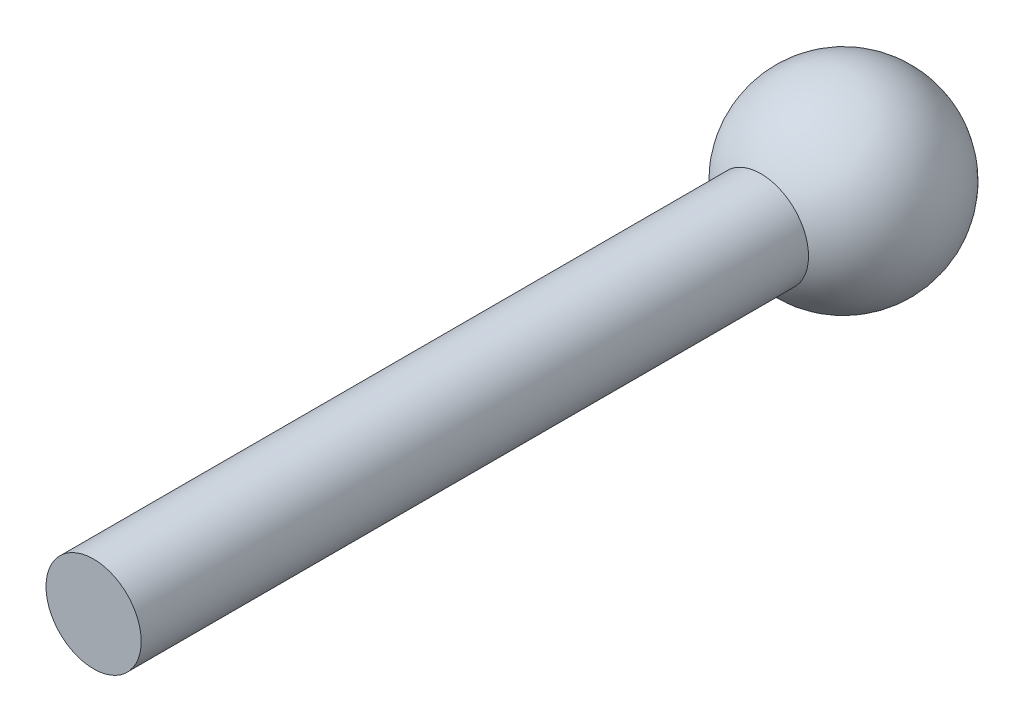
ISO-10303-21;
HEADER;
FILE_DESCRIPTION(('STEP AP214'),'2;1');
FILE_NAME('part.step','',(''),(''),'','','');
FILE_SCHEMA(('AUTOMOTIVE_DESIGN { 1 0 10303 214 1 1 1 1 }'));
ENDSEC;
DATA;
#1=APPLICATION_CONTEXT('core data for automotive mechanical design processes');
#2=APPLICATION_PROTOCOL_DEFINITION('international standard','automotive_design',2000,#1);
#3=PRODUCT_CONTEXT('',#1,'mechanical');
#4=PRODUCT('Part','Part','',(#3));
#5=PRODUCT_RELATED_PRODUCT_CATEGORY('part','',(#4));
#6=PRODUCT_DEFINITION_FORMATION('','',#4);
#7=PRODUCT_DEFINITION_CONTEXT('part definition',#1,'design');
#8=PRODUCT_DEFINITION('design','',#6,#7);
#9=PRODUCT_DEFINITION_SHAPE('','',#8);
#10=(LENGTH_UNIT() NAMED_UNIT(*) SI_UNIT(.MILLI.,.METRE.));
#11=(NAMED_UNIT(*) PLANE_ANGLE_UNIT() SI_UNIT($,.RADIAN.));
#12=(NAMED_UNIT(*) SI_UNIT($,.STERADIAN.) SOLID_ANGLE_UNIT());
#13=UNCERTAINTY_MEASURE_WITH_UNIT(LENGTH_MEASURE(1.E-05),#10,'distance_accuracy_value','');
#14=(GEOMETRIC_REPRESENTATION_CONTEXT(3) GLOBAL_UNCERTAINTY_ASSIGNED_CONTEXT((#13)) GLOBAL_UNIT_ASSIGNED_CONTEXT((#10,
#11,#12)) REPRESENTATION_CONTEXT('',''));
#15=CARTESIAN_POINT('',(0.,0.,0.));
#16=DIRECTION('',(0.,0.,1.));
#17=DIRECTION('',(1.,0.,0.));
#18=AXIS2_PLACEMENT_3D('',#15,#16,#17);
#19=CARTESIAN_POINT('',(0.,0.,75.));
#20=DIRECTION('',(0.,0.,-1.));
#21=DIRECTION('',(-1.,0.,0.));
#22=AXIS2_PLACEMENT_3D('',#19,#20,#21);
#23=CYLINDRICAL_SURFACE('',#22,5.);
#24=CARTESIAN_POINT('',(0.,0.,75.));
#25=DIRECTION('',(0.,0.,1.));
#26=DIRECTION('',(1.,0.,0.));
#27=AXIS2_PLACEMENT_3D('',#24,#25,#26);
#28=CIRCLE('',#27,5.);
#29=CARTESIAN_POINT('',(5.,0.,75.));
#30=VERTEX_POINT('',#29);
#31=EDGE_CURVE('E41',#30,#30,#28,.T.);
#32=ORIENTED_EDGE('',*,*,#31,.F.);
#33=EDGE_LOOP('',(#32));
#34=FACE_BOUND('',#33,.T.);
#35=CARTESIAN_POINT('',(0.,0.,4.89218510203888));
#36=DIRECTION('',(0.,0.,-1.));
#37=DIRECTION('',(-1.,0.,0.));
#38=AXIS2_PLACEMENT_3D('',#35,#36,#37);
#39=CIRCLE('',#38,5.);
#40=CARTESIAN_POINT('',(-5.,0.,4.89218510203888));
#41=VERTEX_POINT('',#40);
#42=EDGE_CURVE('E10',#41,#41,#39,.T.);
#43=ORIENTED_EDGE('',*,*,#42,.F.);
#44=EDGE_LOOP('',(#43));
#45=FACE_BOUND('',#44,.T.);
#46=ADVANCED_FACE('F35',(#34,#45),#23,.T.);
#47=CARTESIAN_POINT('',(0.,0.,75.));
#48=DIRECTION('',(0.,0.,1.));
#49=DIRECTION('',(1.,0.,0.));
#50=AXIS2_PLACEMENT_3D('',#47,#48,#49);
#51=PLANE('',#50);
#52=ORIENTED_EDGE('',*,*,#31,.T.);
#53=EDGE_LOOP('',(#52));
#54=FACE_BOUND('',#53,.T.);
#55=ADVANCED_FACE('F47',(#54),#51,.T.);
#56=CARTESIAN_POINT('',(0.,0.,-3.7680689358055));
#57=DIRECTION('',(0.,0.,-1.));
#58=DIRECTION('',(1.,0.,0.));
#59=AXIS2_PLACEMENT_3D('',#56,#57,#58);
#60=SPHERICAL_SURFACE('',#59,10.);
#61=ORIENTED_EDGE('',*,*,#42,.T.);
#62=EDGE_LOOP('',(#61));
#63=FACE_BOUND('',#62,.T.);
#64=ADVANCED_FACE('F54',(#63),#60,.T.);
#65=CLOSED_SHELL('',(#46,#55,#64));
#66=MANIFOLD_SOLID_BREP('B2',#65);
#67=ADVANCED_BREP_SHAPE_REPRESENTATION('',(#18,#66),#14);
#68=SHAPE_DEFINITION_REPRESENTATION(#9,#67);
ENDSEC;
END-ISO-10303-21;
